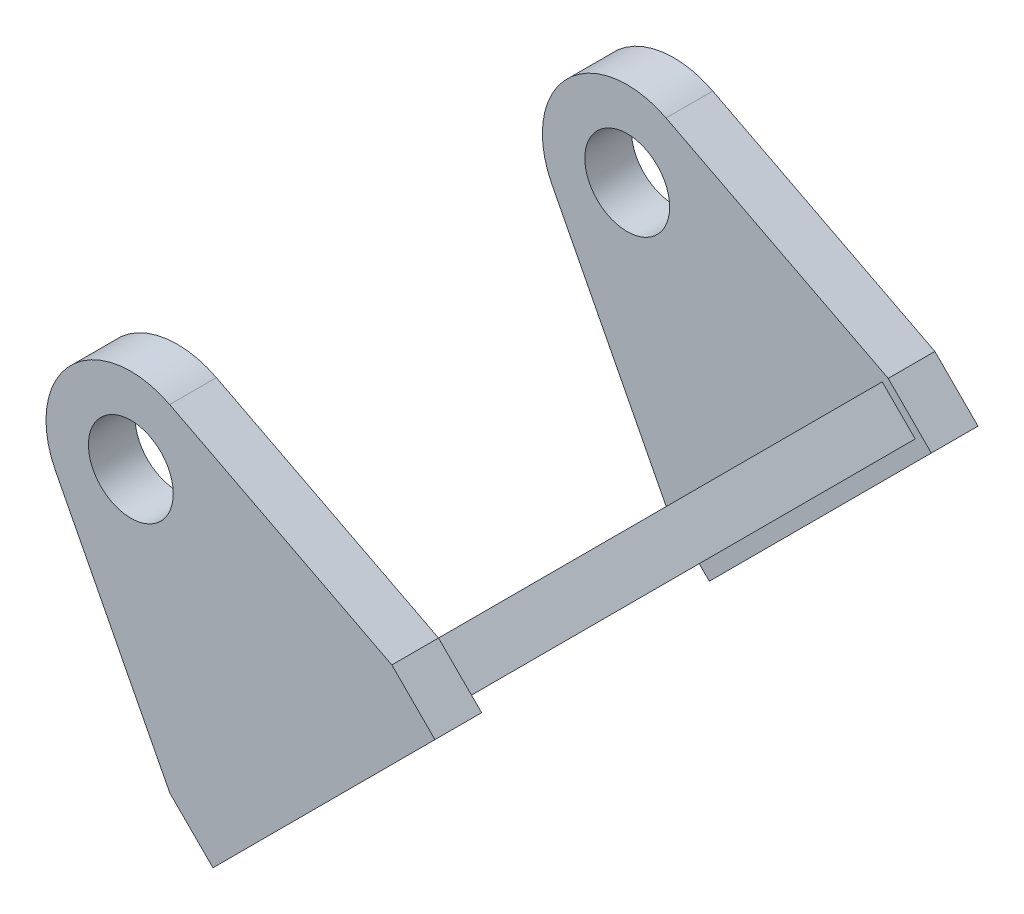
ISO-10303-21;
HEADER;
FILE_DESCRIPTION(('STEP AP214'),'2;1');
FILE_NAME('part.step','',(''),(''),'','','');
FILE_SCHEMA(('AUTOMOTIVE_DESIGN { 1 0 10303 214 1 1 1 1 }'));
ENDSEC;
DATA;
#1=APPLICATION_CONTEXT('core data for automotive mechanical design processes');
#2=APPLICATION_PROTOCOL_DEFINITION('international standard','automotive_design',2000,#1);
#3=PRODUCT_CONTEXT('',#1,'mechanical');
#4=PRODUCT('Part','Part','',(#3));
#5=PRODUCT_RELATED_PRODUCT_CATEGORY('part','',(#4));
#6=PRODUCT_DEFINITION_FORMATION('','',#4);
#7=PRODUCT_DEFINITION_CONTEXT('part definition',#1,'design');
#8=PRODUCT_DEFINITION('design','',#6,#7);
#9=PRODUCT_DEFINITION_SHAPE('','',#8);
#10=(LENGTH_UNIT() NAMED_UNIT(*) SI_UNIT(.MILLI.,.METRE.));
#11=(NAMED_UNIT(*) PLANE_ANGLE_UNIT() SI_UNIT($,.RADIAN.));
#12=(NAMED_UNIT(*) SI_UNIT($,.STERADIAN.) SOLID_ANGLE_UNIT());
#13=UNCERTAINTY_MEASURE_WITH_UNIT(LENGTH_MEASURE(1.E-05),#10,'distance_accuracy_value','');
#14=(GEOMETRIC_REPRESENTATION_CONTEXT(3) GLOBAL_UNCERTAINTY_ASSIGNED_CONTEXT((#13)) GLOBAL_UNIT_ASSIGNED_CONTEXT((#10,
#11,#12)) REPRESENTATION_CONTEXT('',''));
#15=CARTESIAN_POINT('',(0.,0.,0.));
#16=DIRECTION('',(0.,0.,1.));
#17=DIRECTION('',(1.,0.,0.));
#18=AXIS2_PLACEMENT_3D('',#15,#16,#17);
#19=CARTESIAN_POINT('',(-5.30330085889915,30.0520382004283,-32.));
#20=DIRECTION('',(0.,0.,1.));
#21=DIRECTION('',(-1.,0.,0.));
#22=AXIS2_PLACEMENT_3D('',#19,#20,#21);
#23=PLANE('',#22);
#24=DIRECTION('',(0.707106781186548,-0.707106781186547,0.));
#25=VECTOR('',#24,1.);
#26=CARTESIAN_POINT('',(-0.707106781186544,-0.707106781186553,-32.));
#27=LINE('',#26,#25);
#28=CARTESIAN_POINT('',(-0.707106781186544,-0.707106781186553,-32.));
#29=VERTEX_POINT('',#28);
#30=CARTESIAN_POINT('',(4.3760333555334,-5.79024691790649,-32.));
#31=VERTEX_POINT('',#30);
#32=EDGE_CURVE('E145',#29,#31,#27,.T.);
#33=ORIENTED_EDGE('',*,*,#32,.F.);
#34=DIRECTION('',(0.45794289849096,-0.888981609327043,0.));
#35=VECTOR('',#34,1.);
#36=CARTESIAN_POINT('',(-0.707106781186544,-0.707106781186553,-32.));
#37=LINE('',#36,#35);
#38=CARTESIAN_POINT('',(-14.1931169521696,25.4726092155187,-32.));
#39=VERTEX_POINT('',#38);
#40=EDGE_CURVE('E125',#39,#29,#37,.T.);
#41=ORIENTED_EDGE('',*,*,#40,.F.);
#42=CARTESIAN_POINT('',(-5.30330085889915,30.0520382004283,-32.));
#43=DIRECTION('',(0.,0.,1.));
#44=DIRECTION('',(-1.,0.,0.));
#45=AXIS2_PLACEMENT_3D('',#42,#43,#44);
#46=CIRCLE('',#45,10.);
#47=CARTESIAN_POINT('',(-0.72387187398956,38.9418542936987,-32.));
#48=VERTEX_POINT('',#47);
#49=EDGE_CURVE('E106',#48,#39,#46,.T.);
#50=ORIENTED_EDGE('',*,*,#49,.F.);
#51=DIRECTION('',(-0.888981609327043,0.457942898490959,0.));
#52=VECTOR('',#51,1.);
#53=CARTESIAN_POINT('',(-0.723871873989555,38.9418542936987,-32.));
#54=LINE('',#53,#52);
#55=CARTESIAN_POINT('',(25.4558441227157,25.4558441227157,-32.));
#56=VERTEX_POINT('',#55);
#57=EDGE_CURVE('E116',#56,#48,#54,.T.);
#58=ORIENTED_EDGE('',*,*,#57,.F.);
#59=DIRECTION('',(-0.707106781186548,0.707106781186548,0.));
#60=VECTOR('',#59,1.);
#61=CARTESIAN_POINT('',(25.4558441227157,25.4558441227157,-32.));
#62=LINE('',#61,#60);
#63=CARTESIAN_POINT('',(30.5389842594356,20.3727039859958,-32.));
#64=VERTEX_POINT('',#63);
#65=EDGE_CURVE('E121',#64,#56,#62,.T.);
#66=ORIENTED_EDGE('',*,*,#65,.F.);
#67=DIRECTION('',(0.707106781186547,0.707106781186548,0.));
#68=VECTOR('',#67,1.);
#69=CARTESIAN_POINT('',(30.5389842594356,20.3727039859958,-32.));
#70=LINE('',#69,#68);
#71=EDGE_CURVE('E150',#31,#64,#70,.T.);
#72=ORIENTED_EDGE('',*,*,#71,.F.);
#73=EDGE_LOOP('',(#33,#41,#50,#58,#66,#72));
#74=FACE_BOUND('',#73,.T.);
#75=CARTESIAN_POINT('',(-5.30330085889915,30.0520382004283,-32.));
#76=DIRECTION('',(0.,0.,1.));
#77=DIRECTION('',(1.,0.,0.));
#78=AXIS2_PLACEMENT_3D('',#75,#76,#77);
#79=CIRCLE('',#78,5.);
#80=CARTESIAN_POINT('',(-0.303300858899142,30.0520382004283,-32.));
#81=VERTEX_POINT('',#80);
#82=EDGE_CURVE('E134',#81,#81,#79,.T.);
#83=ORIENTED_EDGE('',*,*,#82,.T.);
#84=EDGE_LOOP('',(#83));
#85=FACE_BOUND('',#84,.T.);
#86=ADVANCED_FACE('F45',(#74,#85),#23,.F.);
#87=CARTESIAN_POINT('',(-5.30330085889915,30.0520382004283,-26.5));
#88=DIRECTION('',(0.,0.,1.));
#89=DIRECTION('',(-1.,0.,0.));
#90=AXIS2_PLACEMENT_3D('',#87,#88,#89);
#91=PLANE('',#90);
#92=DIRECTION('',(0.707106781186548,-0.707106781186547,0.));
#93=VECTOR('',#92,1.);
#94=CARTESIAN_POINT('',(-0.707106781186544,-0.707106781186553,-26.5));
#95=LINE('',#94,#93);
#96=CARTESIAN_POINT('',(-0.707106781186544,-0.707106781186553,-26.5));
#97=VERTEX_POINT('',#96);
#98=CARTESIAN_POINT('',(4.3760333555334,-5.79024691790649,-26.5));
#99=VERTEX_POINT('',#98);
#100=EDGE_CURVE('E130',#97,#99,#95,.T.);
#101=ORIENTED_EDGE('',*,*,#100,.T.);
#102=DIRECTION('',(0.707106781186547,0.707106781186548,0.));
#103=VECTOR('',#102,1.);
#104=CARTESIAN_POINT('',(30.5389842594356,20.3727039859958,-26.5));
#105=LINE('',#104,#103);
#106=CARTESIAN_POINT('',(30.5389842594356,20.3727039859958,-26.5));
#107=VERTEX_POINT('',#106);
#108=EDGE_CURVE('E133',#99,#107,#105,.T.);
#109=ORIENTED_EDGE('',*,*,#108,.T.);
#110=DIRECTION('',(-0.707106781186548,0.707106781186548,0.));
#111=VECTOR('',#110,1.);
#112=CARTESIAN_POINT('',(25.4558441227157,25.4558441227157,-26.5));
#113=LINE('',#112,#111);
#114=CARTESIAN_POINT('',(25.4558441227157,25.4558441227157,-26.5));
#115=VERTEX_POINT('',#114);
#116=EDGE_CURVE('E137',#107,#115,#113,.T.);
#117=ORIENTED_EDGE('',*,*,#116,.T.);
#118=DIRECTION('',(-0.888981609327043,0.457942898490959,0.));
#119=VECTOR('',#118,1.);
#120=CARTESIAN_POINT('',(-0.723871873989555,38.9418542936987,-26.5));
#121=LINE('',#120,#119);
#122=CARTESIAN_POINT('',(-0.72387187398956,38.9418542936987,-26.5));
#123=VERTEX_POINT('',#122);
#124=EDGE_CURVE('E140',#115,#123,#121,.T.);
#125=ORIENTED_EDGE('',*,*,#124,.T.);
#126=CARTESIAN_POINT('',(-5.30330085889915,30.0520382004283,-26.5));
#127=DIRECTION('',(0.,0.,1.));
#128=DIRECTION('',(-1.,0.,0.));
#129=AXIS2_PLACEMENT_3D('',#126,#127,#128);
#130=CIRCLE('',#129,10.);
#131=CARTESIAN_POINT('',(-14.1931169521696,25.4726092155187,-26.5));
#132=VERTEX_POINT('',#131);
#133=EDGE_CURVE('E109',#123,#132,#130,.T.);
#134=ORIENTED_EDGE('',*,*,#133,.T.);
#135=DIRECTION('',(0.45794289849096,-0.888981609327043,0.));
#136=VECTOR('',#135,1.);
#137=CARTESIAN_POINT('',(-0.707106781186544,-0.707106781186553,-26.5));
#138=LINE('',#137,#136);
#139=EDGE_CURVE('E143',#132,#97,#138,.T.);
#140=ORIENTED_EDGE('',*,*,#139,.T.);
#141=EDGE_LOOP('',(#101,#109,#117,#125,#134,#140));
#142=FACE_BOUND('',#141,.T.);
#143=CARTESIAN_POINT('',(-5.30330085889915,30.0520382004283,-26.5));
#144=DIRECTION('',(0.,0.,1.));
#145=DIRECTION('',(1.,0.,0.));
#146=AXIS2_PLACEMENT_3D('',#143,#144,#145);
#147=CIRCLE('',#146,5.);
#148=CARTESIAN_POINT('',(-0.303300858899142,30.0520382004283,-26.5));
#149=VERTEX_POINT('',#148);
#150=EDGE_CURVE('E159',#149,#149,#147,.T.);
#151=ORIENTED_EDGE('',*,*,#150,.F.);
#152=EDGE_LOOP('',(#151));
#153=FACE_BOUND('',#152,.T.);
#154=ADVANCED_FACE('F154',(#142,#153),#91,.T.);
#155=CARTESIAN_POINT('',(-0.707106781186544,-0.707106781186553,-32.));
#156=DIRECTION('',(0.707106781186547,0.707106781186548,0.));
#157=DIRECTION('',(-0.707106781186548,0.707106781186547,0.));
#158=AXIS2_PLACEMENT_3D('',#155,#156,#157);
#159=PLANE('',#158);
#160=ORIENTED_EDGE('',*,*,#100,.F.);
#161=DIRECTION('',(0.,0.,1.));
#162=VECTOR('',#161,1.);
#163=CARTESIAN_POINT('',(-0.707106781186544,-0.707106781186553,-32.));
#164=LINE('',#163,#162);
#165=EDGE_CURVE('E62',#29,#97,#164,.T.);
#166=ORIENTED_EDGE('',*,*,#165,.F.);
#167=ORIENTED_EDGE('',*,*,#32,.T.);
#168=DIRECTION('',(0.,0.,1.));
#169=VECTOR('',#168,1.);
#170=CARTESIAN_POINT('',(4.3760333555334,-5.79024691790649,-32.));
#171=LINE('',#170,#169);
#172=EDGE_CURVE('E12',#31,#99,#171,.T.);
#173=ORIENTED_EDGE('',*,*,#172,.T.);
#174=EDGE_LOOP('',(#160,#166,#167,#173));
#175=FACE_BOUND('',#174,.T.);
#176=ADVANCED_FACE('F47',(#175),#159,.F.);
#177=CARTESIAN_POINT('',(30.5389842594356,20.3727039859958,-32.));
#178=DIRECTION('',(-0.707106781186548,0.707106781186547,0.));
#179=DIRECTION('',(-0.707106781186547,-0.707106781186548,0.));
#180=AXIS2_PLACEMENT_3D('',#177,#178,#179);
#181=PLANE('',#180);
#182=ORIENTED_EDGE('',*,*,#108,.F.);
#183=ORIENTED_EDGE('',*,*,#172,.F.);
#184=ORIENTED_EDGE('',*,*,#71,.T.);
#185=DIRECTION('',(0.,0.,1.));
#186=VECTOR('',#185,1.);
#187=CARTESIAN_POINT('',(30.5389842594356,20.3727039859958,-32.));
#188=LINE('',#187,#186);
#189=EDGE_CURVE('E54',#64,#107,#188,.T.);
#190=ORIENTED_EDGE('',*,*,#189,.T.);
#191=EDGE_LOOP('',(#182,#183,#184,#190));
#192=FACE_BOUND('',#191,.T.);
#193=ADVANCED_FACE('F149',(#192),#181,.F.);
#194=CARTESIAN_POINT('',(25.4558441227157,25.4558441227157,-32.));
#195=DIRECTION('',(-0.707106781186548,-0.707106781186548,0.));
#196=DIRECTION('',(0.707106781186548,-0.707106781186548,0.));
#197=AXIS2_PLACEMENT_3D('',#194,#195,#196);
#198=PLANE('',#197);
#199=ORIENTED_EDGE('',*,*,#116,.F.);
#200=ORIENTED_EDGE('',*,*,#189,.F.);
#201=ORIENTED_EDGE('',*,*,#65,.T.);
#202=DIRECTION('',(0.,0.,1.));
#203=VECTOR('',#202,1.);
#204=CARTESIAN_POINT('',(25.4558441227157,25.4558441227157,-32.));
#205=LINE('',#204,#203);
#206=EDGE_CURVE('E113',#56,#115,#205,.T.);
#207=ORIENTED_EDGE('',*,*,#206,.T.);
#208=EDGE_LOOP('',(#199,#200,#201,#207));
#209=FACE_BOUND('',#208,.T.);
#210=ADVANCED_FACE('F152',(#209),#198,.F.);
#211=CARTESIAN_POINT('',(-0.723871873989555,38.9418542936987,-32.));
#212=DIRECTION('',(-0.457942898490959,-0.888981609327043,0.));
#213=DIRECTION('',(0.888981609327043,-0.457942898490959,0.));
#214=AXIS2_PLACEMENT_3D('',#211,#212,#213);
#215=PLANE('',#214);
#216=ORIENTED_EDGE('',*,*,#124,.F.);
#217=ORIENTED_EDGE('',*,*,#206,.F.);
#218=ORIENTED_EDGE('',*,*,#57,.T.);
#219=DIRECTION('',(0.,0.,1.));
#220=VECTOR('',#219,1.);
#221=CARTESIAN_POINT('',(-0.72387187398956,38.9418542936987,-32.));
#222=LINE('',#221,#220);
#223=EDGE_CURVE('E102',#48,#123,#222,.T.);
#224=ORIENTED_EDGE('',*,*,#223,.T.);
#225=EDGE_LOOP('',(#216,#217,#218,#224));
#226=FACE_BOUND('',#225,.T.);
#227=ADVANCED_FACE('F117',(#226),#215,.F.);
#228=CARTESIAN_POINT('',(-5.30330085889915,30.0520382004283,-32.));
#229=DIRECTION('',(0.,0.,1.));
#230=DIRECTION('',(-1.,0.,0.));
#231=AXIS2_PLACEMENT_3D('',#228,#229,#230);
#232=CYLINDRICAL_SURFACE('',#231,10.);
#233=ORIENTED_EDGE('',*,*,#133,.F.);
#234=ORIENTED_EDGE('',*,*,#223,.F.);
#235=ORIENTED_EDGE('',*,*,#49,.T.);
#236=DIRECTION('',(0.,0.,1.));
#237=VECTOR('',#236,1.);
#238=CARTESIAN_POINT('',(-14.1931169521696,25.4726092155187,-32.));
#239=LINE('',#238,#237);
#240=EDGE_CURVE('E84',#39,#132,#239,.T.);
#241=ORIENTED_EDGE('',*,*,#240,.T.);
#242=EDGE_LOOP('',(#233,#234,#235,#241));
#243=FACE_BOUND('',#242,.T.);
#244=ADVANCED_FACE('F104',(#243),#232,.T.);
#245=CARTESIAN_POINT('',(-0.707106781186544,-0.707106781186553,-32.));
#246=DIRECTION('',(0.888981609327043,0.45794289849096,0.));
#247=DIRECTION('',(-0.45794289849096,0.888981609327043,0.));
#248=AXIS2_PLACEMENT_3D('',#245,#246,#247);
#249=PLANE('',#248);
#250=ORIENTED_EDGE('',*,*,#139,.F.);
#251=ORIENTED_EDGE('',*,*,#240,.F.);
#252=ORIENTED_EDGE('',*,*,#40,.T.);
#253=ORIENTED_EDGE('',*,*,#165,.T.);
#254=EDGE_LOOP('',(#250,#251,#252,#253));
#255=FACE_BOUND('',#254,.T.);
#256=ADVANCED_FACE('F168',(#255),#249,.F.);
#257=CARTESIAN_POINT('',(-5.30330085889915,30.0520382004283,-32.));
#258=DIRECTION('',(0.,0.,1.));
#259=DIRECTION('',(-1.,0.,0.));
#260=AXIS2_PLACEMENT_3D('',#257,#258,#259);
#261=CYLINDRICAL_SURFACE('',#260,5.);
#262=ORIENTED_EDGE('',*,*,#82,.F.);
#263=EDGE_LOOP('',(#262));
#264=FACE_BOUND('',#263,.T.);
#265=ORIENTED_EDGE('',*,*,#150,.T.);
#266=EDGE_LOOP('',(#265));
#267=FACE_BOUND('',#266,.T.);
#268=ADVANCED_FACE('F165',(#264,#267),#261,.F.);
#269=CLOSED_SHELL('',(#86,#154,#176,#193,#210,#227,#244,#256,#268));
#270=MANIFOLD_SOLID_BREP('B2',#269);
#271=CARTESIAN_POINT('',(-5.30330085889915,30.0520382004283,32.));
#272=DIRECTION('',(0.,0.,-1.));
#273=DIRECTION('',(-1.,0.,0.));
#274=AXIS2_PLACEMENT_3D('',#271,#272,#273);
#275=PLANE('',#274);
#276=DIRECTION('',(0.707106781186548,-0.707106781186547,0.));
#277=VECTOR('',#276,1.);
#278=CARTESIAN_POINT('',(-0.707106781186544,-0.707106781186553,32.));
#279=LINE('',#278,#277);
#280=CARTESIAN_POINT('',(-0.707106781186544,-0.707106781186553,32.));
#281=VERTEX_POINT('',#280);
#282=CARTESIAN_POINT('',(4.3760333555334,-5.79024691790649,32.));
#283=VERTEX_POINT('',#282);
#284=EDGE_CURVE('E346',#281,#283,#279,.T.);
#285=ORIENTED_EDGE('',*,*,#284,.T.);
#286=DIRECTION('',(0.707106781186547,0.707106781186548,0.));
#287=VECTOR('',#286,1.);
#288=CARTESIAN_POINT('',(30.5389842594356,20.3727039859958,32.));
#289=LINE('',#288,#287);
#290=CARTESIAN_POINT('',(30.5389842594356,20.3727039859958,32.));
#291=VERTEX_POINT('',#290);
#292=EDGE_CURVE('E304',#283,#291,#289,.T.);
#293=ORIENTED_EDGE('',*,*,#292,.T.);
#294=DIRECTION('',(-0.707106781186548,0.707106781186548,0.));
#295=VECTOR('',#294,1.);
#296=CARTESIAN_POINT('',(25.4558441227157,25.4558441227157,32.));
#297=LINE('',#296,#295);
#298=CARTESIAN_POINT('',(25.4558441227157,25.4558441227157,32.));
#299=VERTEX_POINT('',#298);
#300=EDGE_CURVE('E317',#291,#299,#297,.T.);
#301=ORIENTED_EDGE('',*,*,#300,.T.);
#302=DIRECTION('',(-0.888981609327043,0.457942898490959,0.));
#303=VECTOR('',#302,1.);
#304=CARTESIAN_POINT('',(-0.723871873989555,38.9418542936987,32.));
#305=LINE('',#304,#303);
#306=CARTESIAN_POINT('',(-0.72387187398956,38.9418542936987,32.));
#307=VERTEX_POINT('',#306);
#308=EDGE_CURVE('E311',#299,#307,#305,.T.);
#309=ORIENTED_EDGE('',*,*,#308,.T.);
#310=CARTESIAN_POINT('',(-5.30330085889915,30.0520382004283,32.));
#311=DIRECTION('',(0.,0.,1.));
#312=DIRECTION('',(-1.,0.,0.));
#313=AXIS2_PLACEMENT_3D('',#310,#311,#312);
#314=CIRCLE('',#313,10.);
#315=CARTESIAN_POINT('',(-14.1931169521696,25.4726092155187,32.));
#316=VERTEX_POINT('',#315);
#317=EDGE_CURVE('E315',#307,#316,#314,.T.);
#318=ORIENTED_EDGE('',*,*,#317,.T.);
#319=DIRECTION('',(0.45794289849096,-0.888981609327043,0.));
#320=VECTOR('',#319,1.);
#321=CARTESIAN_POINT('',(-0.707106781186544,-0.707106781186553,32.));
#322=LINE('',#321,#320);
#323=EDGE_CURVE('E267',#316,#281,#322,.T.);
#324=ORIENTED_EDGE('',*,*,#323,.T.);
#325=EDGE_LOOP('',(#285,#293,#301,#309,#318,#324));
#326=FACE_BOUND('',#325,.T.);
#327=CARTESIAN_POINT('',(-5.30330085889915,30.0520382004283,32.));
#328=DIRECTION('',(0.,0.,1.));
#329=DIRECTION('',(1.,0.,0.));
#330=AXIS2_PLACEMENT_3D('',#327,#328,#329);
#331=CIRCLE('',#330,5.);
#332=CARTESIAN_POINT('',(-0.303300858899142,30.0520382004283,32.));
#333=VERTEX_POINT('',#332);
#334=EDGE_CURVE('E339',#333,#333,#331,.T.);
#335=ORIENTED_EDGE('',*,*,#334,.F.);
#336=EDGE_LOOP('',(#335));
#337=FACE_BOUND('',#336,.T.);
#338=ADVANCED_FACE('F250',(#326,#337),#275,.F.);
#339=CARTESIAN_POINT('',(-5.30330085889915,30.0520382004283,26.5));
#340=DIRECTION('',(0.,0.,-1.));
#341=DIRECTION('',(-1.,0.,0.));
#342=AXIS2_PLACEMENT_3D('',#339,#340,#341);
#343=PLANE('',#342);
#344=DIRECTION('',(0.707106781186548,-0.707106781186547,0.));
#345=VECTOR('',#344,1.);
#346=CARTESIAN_POINT('',(-0.707106781186544,-0.707106781186553,26.5));
#347=LINE('',#346,#345);
#348=CARTESIAN_POINT('',(-0.707106781186544,-0.707106781186553,26.5));
#349=VERTEX_POINT('',#348);
#350=CARTESIAN_POINT('',(4.3760333555334,-5.79024691790649,26.5));
#351=VERTEX_POINT('',#350);
#352=EDGE_CURVE('E335',#349,#351,#347,.T.);
#353=ORIENTED_EDGE('',*,*,#352,.F.);
#354=DIRECTION('',(0.45794289849096,-0.888981609327043,0.));
#355=VECTOR('',#354,1.);
#356=CARTESIAN_POINT('',(-0.707106781186544,-0.707106781186553,26.5));
#357=LINE('',#356,#355);
#358=CARTESIAN_POINT('',(-14.1931169521696,25.4726092155187,26.5));
#359=VERTEX_POINT('',#358);
#360=EDGE_CURVE('E296',#359,#349,#357,.T.);
#361=ORIENTED_EDGE('',*,*,#360,.F.);
#362=CARTESIAN_POINT('',(-5.30330085889915,30.0520382004283,26.5));
#363=DIRECTION('',(0.,0.,1.));
#364=DIRECTION('',(-1.,0.,0.));
#365=AXIS2_PLACEMENT_3D('',#362,#363,#364);
#366=CIRCLE('',#365,10.);
#367=CARTESIAN_POINT('',(-0.72387187398956,38.9418542936987,26.5));
#368=VERTEX_POINT('',#367);
#369=EDGE_CURVE('E290',#368,#359,#366,.T.);
#370=ORIENTED_EDGE('',*,*,#369,.F.);
#371=DIRECTION('',(-0.888981609327043,0.457942898490959,0.));
#372=VECTOR('',#371,1.);
#373=CARTESIAN_POINT('',(-0.723871873989555,38.9418542936987,26.5));
#374=LINE('',#373,#372);
#375=CARTESIAN_POINT('',(25.4558441227157,25.4558441227157,26.5));
#376=VERTEX_POINT('',#375);
#377=EDGE_CURVE('E325',#376,#368,#374,.T.);
#378=ORIENTED_EDGE('',*,*,#377,.F.);
#379=DIRECTION('',(-0.707106781186548,0.707106781186548,0.));
#380=VECTOR('',#379,1.);
#381=CARTESIAN_POINT('',(25.4558441227157,25.4558441227157,26.5));
#382=LINE('',#381,#380);
#383=CARTESIAN_POINT('',(30.5389842594356,20.3727039859958,26.5));
#384=VERTEX_POINT('',#383);
#385=EDGE_CURVE('E341',#384,#376,#382,.T.);
#386=ORIENTED_EDGE('',*,*,#385,.F.);
#387=DIRECTION('',(0.707106781186547,0.707106781186548,0.));
#388=VECTOR('',#387,1.);
#389=CARTESIAN_POINT('',(30.5389842594356,20.3727039859958,26.5));
#390=LINE('',#389,#388);
#391=EDGE_CURVE('E338',#351,#384,#390,.T.);
#392=ORIENTED_EDGE('',*,*,#391,.F.);
#393=EDGE_LOOP('',(#353,#361,#370,#378,#386,#392));
#394=FACE_BOUND('',#393,.T.);
#395=CARTESIAN_POINT('',(-5.30330085889915,30.0520382004283,26.5));
#396=DIRECTION('',(0.,0.,1.));
#397=DIRECTION('',(1.,0.,0.));
#398=AXIS2_PLACEMENT_3D('',#395,#396,#397);
#399=CIRCLE('',#398,5.);
#400=CARTESIAN_POINT('',(-0.303300858899142,30.0520382004283,26.5));
#401=VERTEX_POINT('',#400);
#402=EDGE_CURVE('E439',#401,#401,#399,.T.);
#403=ORIENTED_EDGE('',*,*,#402,.T.);
#404=EDGE_LOOP('',(#403));
#405=FACE_BOUND('',#404,.T.);
#406=ADVANCED_FACE('F355',(#394,#405),#343,.T.);
#407=CARTESIAN_POINT('',(-0.707106781186544,-0.707106781186553,32.));
#408=DIRECTION('',(0.707106781186547,0.707106781186548,0.));
#409=DIRECTION('',(-0.707106781186548,0.707106781186547,0.));
#410=AXIS2_PLACEMENT_3D('',#407,#408,#409);
#411=PLANE('',#410);
#412=ORIENTED_EDGE('',*,*,#352,.T.);
#413=DIRECTION('',(0.,0.,-1.));
#414=VECTOR('',#413,1.);
#415=CARTESIAN_POINT('',(4.3760333555334,-5.79024691790649,32.));
#416=LINE('',#415,#414);
#417=EDGE_CURVE('E43',#283,#351,#416,.T.);
#418=ORIENTED_EDGE('',*,*,#417,.F.);
#419=ORIENTED_EDGE('',*,*,#284,.F.);
#420=DIRECTION('',(0.,0.,-1.));
#421=VECTOR('',#420,1.);
#422=CARTESIAN_POINT('',(-0.707106781186544,-0.707106781186553,32.));
#423=LINE('',#422,#421);
#424=EDGE_CURVE('E331',#281,#349,#423,.T.);
#425=ORIENTED_EDGE('',*,*,#424,.T.);
#426=EDGE_LOOP('',(#412,#418,#419,#425));
#427=FACE_BOUND('',#426,.T.);
#428=ADVANCED_FACE('F252',(#427),#411,.F.);
#429=CARTESIAN_POINT('',(30.5389842594356,20.3727039859958,32.));
#430=DIRECTION('',(-0.707106781186548,0.707106781186547,0.));
#431=DIRECTION('',(-0.707106781186547,-0.707106781186548,0.));
#432=AXIS2_PLACEMENT_3D('',#429,#430,#431);
#433=PLANE('',#432);
#434=ORIENTED_EDGE('',*,*,#391,.T.);
#435=DIRECTION('',(0.,0.,-1.));
#436=VECTOR('',#435,1.);
#437=CARTESIAN_POINT('',(30.5389842594356,20.3727039859958,32.));
#438=LINE('',#437,#436);
#439=EDGE_CURVE('E259',#291,#384,#438,.T.);
#440=ORIENTED_EDGE('',*,*,#439,.F.);
#441=ORIENTED_EDGE('',*,*,#292,.F.);
#442=ORIENTED_EDGE('',*,*,#417,.T.);
#443=EDGE_LOOP('',(#434,#440,#441,#442));
#444=FACE_BOUND('',#443,.T.);
#445=ADVANCED_FACE('F380',(#444),#433,.F.);
#446=CARTESIAN_POINT('',(25.4558441227157,25.4558441227157,32.));
#447=DIRECTION('',(-0.707106781186548,-0.707106781186548,0.));
#448=DIRECTION('',(0.707106781186548,-0.707106781186548,0.));
#449=AXIS2_PLACEMENT_3D('',#446,#447,#448);
#450=PLANE('',#449);
#451=ORIENTED_EDGE('',*,*,#385,.T.);
#452=DIRECTION('',(0.,0.,-1.));
#453=VECTOR('',#452,1.);
#454=CARTESIAN_POINT('',(25.4558441227157,25.4558441227157,32.));
#455=LINE('',#454,#453);
#456=EDGE_CURVE('E326',#299,#376,#455,.T.);
#457=ORIENTED_EDGE('',*,*,#456,.F.);
#458=ORIENTED_EDGE('',*,*,#300,.F.);
#459=ORIENTED_EDGE('',*,*,#439,.T.);
#460=EDGE_LOOP('',(#451,#457,#458,#459));
#461=FACE_BOUND('',#460,.T.);
#462=ADVANCED_FACE('F352',(#461),#450,.F.);
#463=CARTESIAN_POINT('',(-0.723871873989555,38.9418542936987,32.));
#464=DIRECTION('',(-0.457942898490959,-0.888981609327043,0.));
#465=DIRECTION('',(0.888981609327043,-0.457942898490959,0.));
#466=AXIS2_PLACEMENT_3D('',#463,#464,#465);
#467=PLANE('',#466);
#468=ORIENTED_EDGE('',*,*,#377,.T.);
#469=DIRECTION('',(0.,0.,-1.));
#470=VECTOR('',#469,1.);
#471=CARTESIAN_POINT('',(-0.72387187398956,38.9418542936987,32.));
#472=LINE('',#471,#470);
#473=EDGE_CURVE('E322',#307,#368,#472,.T.);
#474=ORIENTED_EDGE('',*,*,#473,.F.);
#475=ORIENTED_EDGE('',*,*,#308,.F.);
#476=ORIENTED_EDGE('',*,*,#456,.T.);
#477=EDGE_LOOP('',(#468,#474,#475,#476));
#478=FACE_BOUND('',#477,.T.);
#479=ADVANCED_FACE('F323',(#478),#467,.F.);
#480=CARTESIAN_POINT('',(-5.30330085889915,30.0520382004283,32.));
#481=DIRECTION('',(0.,0.,-1.));
#482=DIRECTION('',(-1.,0.,0.));
#483=AXIS2_PLACEMENT_3D('',#480,#481,#482);
#484=CYLINDRICAL_SURFACE('',#483,10.);
#485=ORIENTED_EDGE('',*,*,#369,.T.);
#486=DIRECTION('',(0.,0.,-1.));
#487=VECTOR('',#486,1.);
#488=CARTESIAN_POINT('',(-14.1931169521696,25.4726092155187,32.));
#489=LINE('',#488,#487);
#490=EDGE_CURVE('E327',#316,#359,#489,.T.);
#491=ORIENTED_EDGE('',*,*,#490,.F.);
#492=ORIENTED_EDGE('',*,*,#317,.F.);
#493=ORIENTED_EDGE('',*,*,#473,.T.);
#494=EDGE_LOOP('',(#485,#491,#492,#493));
#495=FACE_BOUND('',#494,.T.);
#496=ADVANCED_FACE('F329',(#495),#484,.T.);
#497=CARTESIAN_POINT('',(-0.707106781186544,-0.707106781186553,32.));
#498=DIRECTION('',(0.888981609327043,0.45794289849096,0.));
#499=DIRECTION('',(-0.45794289849096,0.888981609327043,0.));
#500=AXIS2_PLACEMENT_3D('',#497,#498,#499);
#501=PLANE('',#500);
#502=ORIENTED_EDGE('',*,*,#360,.T.);
#503=ORIENTED_EDGE('',*,*,#424,.F.);
#504=ORIENTED_EDGE('',*,*,#323,.F.);
#505=ORIENTED_EDGE('',*,*,#490,.T.);
#506=EDGE_LOOP('',(#502,#503,#504,#505));
#507=FACE_BOUND('',#506,.T.);
#508=ADVANCED_FACE('F360',(#507),#501,.F.);
#509=CARTESIAN_POINT('',(-5.30330085889915,30.0520382004283,32.));
#510=DIRECTION('',(0.,0.,-1.));
#511=DIRECTION('',(-1.,0.,0.));
#512=AXIS2_PLACEMENT_3D('',#509,#510,#511);
#513=CYLINDRICAL_SURFACE('',#512,5.);
#514=ORIENTED_EDGE('',*,*,#334,.T.);
#515=EDGE_LOOP('',(#514));
#516=FACE_BOUND('',#515,.T.);
#517=ORIENTED_EDGE('',*,*,#402,.F.);
#518=EDGE_LOOP('',(#517));
#519=FACE_BOUND('',#518,.T.);
#520=ADVANCED_FACE('F362',(#516,#519),#513,.F.);
#521=CLOSED_SHELL('',(#338,#406,#428,#445,#462,#479,#496,#508,#520));
#522=MANIFOLD_SOLID_BREP('B6',#521);
#523=CARTESIAN_POINT('',(0.,0.,27.));
#524=DIRECTION('',(0.707106781186549,-0.707106781186546,0.));
#525=DIRECTION('',(0.707106781186546,0.707106781186549,0.));
#526=AXIS2_PLACEMENT_3D('',#523,#524,#525);
#527=PLANE('',#526);
#528=CARTESIAN_POINT('',(20.1525432638166,20.1525432638166,8.));
#529=DIRECTION('',(-0.707106781186549,0.707106781186546,0.));
#530=DIRECTION('',(-0.707106781186546,-0.707106781186549,0.));
#531=AXIS2_PLACEMENT_3D('',#528,#529,#530);
#532=CIRCLE('',#531,2.5);
#533=CARTESIAN_POINT('',(18.3847763108502,18.3847763108503,8.));
#534=VERTEX_POINT('',#533);
#535=EDGE_CURVE('E522',#534,#534,#532,.T.);
#536=ORIENTED_EDGE('',*,*,#535,.F.);
#537=EDGE_LOOP('',(#536));
#538=FACE_BOUND('',#537,.T.);
#539=CARTESIAN_POINT('',(4.59619407771256,4.59619407771257,-1.));
#540=DIRECTION('',(-0.707106781186549,0.707106781186546,0.));
#541=DIRECTION('',(-0.707106781186546,-0.707106781186549,0.));
#542=AXIS2_PLACEMENT_3D('',#539,#540,#541);
#543=CIRCLE('',#542,2.5);
#544=CARTESIAN_POINT('',(2.82842712474619,2.8284271247462,-1.));
#545=VERTEX_POINT('',#544);
#546=EDGE_CURVE('E527',#545,#545,#543,.T.);
#547=ORIENTED_EDGE('',*,*,#546,.F.);
#548=EDGE_LOOP('',(#547));
#549=FACE_BOUND('',#548,.T.);
#550=DIRECTION('',(-0.707106781186546,-0.707106781186549,0.));
#551=VECTOR('',#550,1.);
#552=CARTESIAN_POINT('',(0.,0.,-27.));
#553=LINE('',#552,#551);
#554=CARTESIAN_POINT('',(24.7487373415291,24.7487373415292,-27.));
#555=VERTEX_POINT('',#554);
#556=CARTESIAN_POINT('',(0.,0.,-27.));
#557=VERTEX_POINT('',#556);
#558=EDGE_CURVE('E513',#555,#557,#553,.T.);
#559=ORIENTED_EDGE('',*,*,#558,.T.);
#560=DIRECTION('',(0.,0.,-1.));
#561=VECTOR('',#560,1.);
#562=CARTESIAN_POINT('',(0.,0.,27.));
#563=LINE('',#562,#561);
#564=CARTESIAN_POINT('',(0.,0.,27.));
#565=VERTEX_POINT('',#564);
#566=EDGE_CURVE('E248',#565,#557,#563,.T.);
#567=ORIENTED_EDGE('',*,*,#566,.F.);
#568=DIRECTION('',(-0.707106781186546,-0.707106781186549,0.));
#569=VECTOR('',#568,1.);
#570=CARTESIAN_POINT('',(0.,0.,27.));
#571=LINE('',#570,#569);
#572=CARTESIAN_POINT('',(24.7487373415291,24.7487373415292,27.));
#573=VERTEX_POINT('',#572);
#574=EDGE_CURVE('E500',#573,#565,#571,.T.);
#575=ORIENTED_EDGE('',*,*,#574,.F.);
#576=DIRECTION('',(0.,0.,-1.));
#577=VECTOR('',#576,1.);
#578=CARTESIAN_POINT('',(24.7487373415291,24.7487373415292,27.));
#579=LINE('',#578,#577);
#580=EDGE_CURVE('E509',#573,#555,#579,.T.);
#581=ORIENTED_EDGE('',*,*,#580,.T.);
#582=EDGE_LOOP('',(#559,#567,#575,#581));
#583=FACE_BOUND('',#582,.T.);
#584=ADVANCED_FACE('F447',(#538,#549,#583),#527,.F.);
#585=CARTESIAN_POINT('',(0.,0.,27.));
#586=DIRECTION('',(0.707106781186546,0.707106781186549,0.));
#587=DIRECTION('',(-0.707106781186549,0.707106781186546,0.));
#588=AXIS2_PLACEMENT_3D('',#585,#586,#587);
#589=PLANE('',#588);
#590=DIRECTION('',(0.707106781186549,-0.707106781186546,0.));
#591=VECTOR('',#590,1.);
#592=CARTESIAN_POINT('',(0.,0.,-27.));
#593=LINE('',#592,#591);
#594=CARTESIAN_POINT('',(3.88908729652603,-3.88908729652601,-27.));
#595=VERTEX_POINT('',#594);
#596=EDGE_CURVE('E504',#557,#595,#593,.T.);
#597=ORIENTED_EDGE('',*,*,#596,.T.);
#598=DIRECTION('',(0.,0.,-1.));
#599=VECTOR('',#598,1.);
#600=CARTESIAN_POINT('',(3.88908729652603,-3.88908729652601,27.));
#601=LINE('',#600,#599);
#602=CARTESIAN_POINT('',(3.88908729652603,-3.88908729652601,27.));
#603=VERTEX_POINT('',#602);
#604=EDGE_CURVE('E456',#603,#595,#601,.T.);
#605=ORIENTED_EDGE('',*,*,#604,.F.);
#606=DIRECTION('',(0.707106781186549,-0.707106781186546,0.));
#607=VECTOR('',#606,1.);
#608=CARTESIAN_POINT('',(0.,0.,27.));
#609=LINE('',#608,#607);
#610=EDGE_CURVE('E495',#565,#603,#609,.T.);
#611=ORIENTED_EDGE('',*,*,#610,.F.);
#612=ORIENTED_EDGE('',*,*,#566,.T.);
#613=EDGE_LOOP('',(#597,#605,#611,#612));
#614=FACE_BOUND('',#613,.T.);
#615=ADVANCED_FACE('F503',(#614),#589,.F.);
#616=CARTESIAN_POINT('',(3.88908729652603,-3.88908729652601,27.));
#617=DIRECTION('',(-0.707106781186549,0.707106781186546,0.));
#618=DIRECTION('',(-0.707106781186546,-0.707106781186549,0.));
#619=AXIS2_PLACEMENT_3D('',#616,#617,#618);
#620=PLANE('',#619);
#621=CARTESIAN_POINT('',(24.0416305603426,16.2634559672906,8.));
#622=DIRECTION('',(-0.707106781186549,0.707106781186546,0.));
#623=DIRECTION('',(-0.707106781186546,-0.707106781186549,0.));
#624=AXIS2_PLACEMENT_3D('',#621,#622,#623);
#625=CIRCLE('',#624,2.5);
#626=CARTESIAN_POINT('',(22.2738636073762,14.4956890143243,8.));
#627=VERTEX_POINT('',#626);
#628=EDGE_CURVE('E450',#627,#627,#625,.T.);
#629=ORIENTED_EDGE('',*,*,#628,.T.);
#630=EDGE_LOOP('',(#629));
#631=FACE_BOUND('',#630,.T.);
#632=CARTESIAN_POINT('',(8.48528137423858,0.707106781186556,-1.));
#633=DIRECTION('',(-0.707106781186549,0.707106781186546,0.));
#634=DIRECTION('',(-0.707106781186546,-0.707106781186549,0.));
#635=AXIS2_PLACEMENT_3D('',#632,#633,#634);
#636=CIRCLE('',#635,2.5);
#637=CARTESIAN_POINT('',(6.71751442127221,-1.06066017177982,-1.));
#638=VERTEX_POINT('',#637);
#639=EDGE_CURVE('E520',#638,#638,#636,.T.);
#640=ORIENTED_EDGE('',*,*,#639,.T.);
#641=EDGE_LOOP('',(#640));
#642=FACE_BOUND('',#641,.T.);
#643=DIRECTION('',(0.707106781186546,0.707106781186549,0.));
#644=VECTOR('',#643,1.);
#645=CARTESIAN_POINT('',(3.88908729652603,-3.88908729652601,-27.));
#646=LINE('',#645,#644);
#647=CARTESIAN_POINT('',(28.6378246380551,20.8596500450032,-27.));
#648=VERTEX_POINT('',#647);
#649=EDGE_CURVE('E482',#595,#648,#646,.T.);
#650=ORIENTED_EDGE('',*,*,#649,.T.);
#651=DIRECTION('',(0.,0.,-1.));
#652=VECTOR('',#651,1.);
#653=CARTESIAN_POINT('',(28.6378246380551,20.8596500450032,27.));
#654=LINE('',#653,#652);
#655=CARTESIAN_POINT('',(28.6378246380551,20.8596500450032,27.));
#656=VERTEX_POINT('',#655);
#657=EDGE_CURVE('E505',#656,#648,#654,.T.);
#658=ORIENTED_EDGE('',*,*,#657,.F.);
#659=DIRECTION('',(0.707106781186546,0.707106781186549,0.));
#660=VECTOR('',#659,1.);
#661=CARTESIAN_POINT('',(3.88908729652603,-3.88908729652601,27.));
#662=LINE('',#661,#660);
#663=EDGE_CURVE('E498',#603,#656,#662,.T.);
#664=ORIENTED_EDGE('',*,*,#663,.F.);
#665=ORIENTED_EDGE('',*,*,#604,.T.);
#666=EDGE_LOOP('',(#650,#658,#664,#665));
#667=FACE_BOUND('',#666,.T.);
#668=ADVANCED_FACE('F507',(#631,#642,#667),#620,.F.);
#669=CARTESIAN_POINT('',(24.7487373415291,24.7487373415292,27.));
#670=DIRECTION('',(-0.707106781186548,-0.707106781186547,0.));
#671=DIRECTION('',(0.707106781186547,-0.707106781186548,0.));
#672=AXIS2_PLACEMENT_3D('',#669,#670,#671);
#673=PLANE('',#672);
#674=DIRECTION('',(-0.707106781186547,0.707106781186548,0.));
#675=VECTOR('',#674,1.);
#676=CARTESIAN_POINT('',(24.7487373415291,24.7487373415292,-27.));
#677=LINE('',#676,#675);
#678=EDGE_CURVE('E488',#648,#555,#677,.T.);
#679=ORIENTED_EDGE('',*,*,#678,.T.);
#680=ORIENTED_EDGE('',*,*,#580,.F.);
#681=DIRECTION('',(-0.707106781186547,0.707106781186548,0.));
#682=VECTOR('',#681,1.);
#683=CARTESIAN_POINT('',(24.7487373415291,24.7487373415292,27.));
#684=LINE('',#683,#682);
#685=EDGE_CURVE('E465',#656,#573,#684,.T.);
#686=ORIENTED_EDGE('',*,*,#685,.F.);
#687=ORIENTED_EDGE('',*,*,#657,.T.);
#688=EDGE_LOOP('',(#679,#680,#686,#687));
#689=FACE_BOUND('',#688,.T.);
#690=ADVANCED_FACE('F552',(#689),#673,.F.);
#691=CARTESIAN_POINT('',(0.,0.,27.));
#692=DIRECTION('',(0.,0.,-1.));
#693=DIRECTION('',(-1.,0.,0.));
#694=AXIS2_PLACEMENT_3D('',#691,#692,#693);
#695=PLANE('',#694);
#696=ORIENTED_EDGE('',*,*,#574,.T.);
#697=ORIENTED_EDGE('',*,*,#610,.T.);
#698=ORIENTED_EDGE('',*,*,#663,.T.);
#699=ORIENTED_EDGE('',*,*,#685,.T.);
#700=EDGE_LOOP('',(#696,#697,#698,#699));
#701=FACE_BOUND('',#700,.T.);
#702=ADVANCED_FACE('F496',(#701),#695,.F.);
#703=CARTESIAN_POINT('',(0.,0.,-27.));
#704=DIRECTION('',(0.,0.,-1.));
#705=DIRECTION('',(-1.,0.,0.));
#706=AXIS2_PLACEMENT_3D('',#703,#704,#705);
#707=PLANE('',#706);
#708=ORIENTED_EDGE('',*,*,#558,.F.);
#709=ORIENTED_EDGE('',*,*,#678,.F.);
#710=ORIENTED_EDGE('',*,*,#649,.F.);
#711=ORIENTED_EDGE('',*,*,#596,.F.);
#712=EDGE_LOOP('',(#708,#709,#710,#711));
#713=FACE_BOUND('',#712,.T.);
#714=ADVANCED_FACE('F543',(#713),#707,.T.);
#715=CARTESIAN_POINT('',(11.667261889578,-2.4748737341529,-1.));
#716=DIRECTION('',(-0.707106781186549,0.707106781186546,0.));
#717=DIRECTION('',(-0.707106781186546,-0.707106781186549,0.));
#718=AXIS2_PLACEMENT_3D('',#715,#716,#717);
#719=CYLINDRICAL_SURFACE('',#718,2.5);
#720=ORIENTED_EDGE('',*,*,#546,.T.);
#721=EDGE_LOOP('',(#720));
#722=FACE_BOUND('',#721,.T.);
#723=ORIENTED_EDGE('',*,*,#639,.F.);
#724=EDGE_LOOP('',(#723));
#725=FACE_BOUND('',#724,.T.);
#726=ADVANCED_FACE('F535',(#722,#725),#719,.F.);
#727=CARTESIAN_POINT('',(27.2236110756821,13.0814754519512,8.));
#728=DIRECTION('',(-0.707106781186549,0.707106781186546,0.));
#729=DIRECTION('',(-0.707106781186546,-0.707106781186549,0.));
#730=AXIS2_PLACEMENT_3D('',#727,#728,#729);
#731=CYLINDRICAL_SURFACE('',#730,2.5);
#732=ORIENTED_EDGE('',*,*,#535,.T.);
#733=EDGE_LOOP('',(#732));
#734=FACE_BOUND('',#733,.T.);
#735=ORIENTED_EDGE('',*,*,#628,.F.);
#736=EDGE_LOOP('',(#735));
#737=FACE_BOUND('',#736,.T.);
#738=ADVANCED_FACE('F550',(#734,#737),#731,.F.);
#739=CLOSED_SHELL('',(#584,#615,#668,#690,#702,#714,#726,#738));
#740=MANIFOLD_SOLID_BREP('B37',#739);
#741=ADVANCED_BREP_SHAPE_REPRESENTATION('',(#18,#270,#522,#740),#14);
#742=SHAPE_DEFINITION_REPRESENTATION(#9,#741);
ENDSEC;
END-ISO-10303-21;
